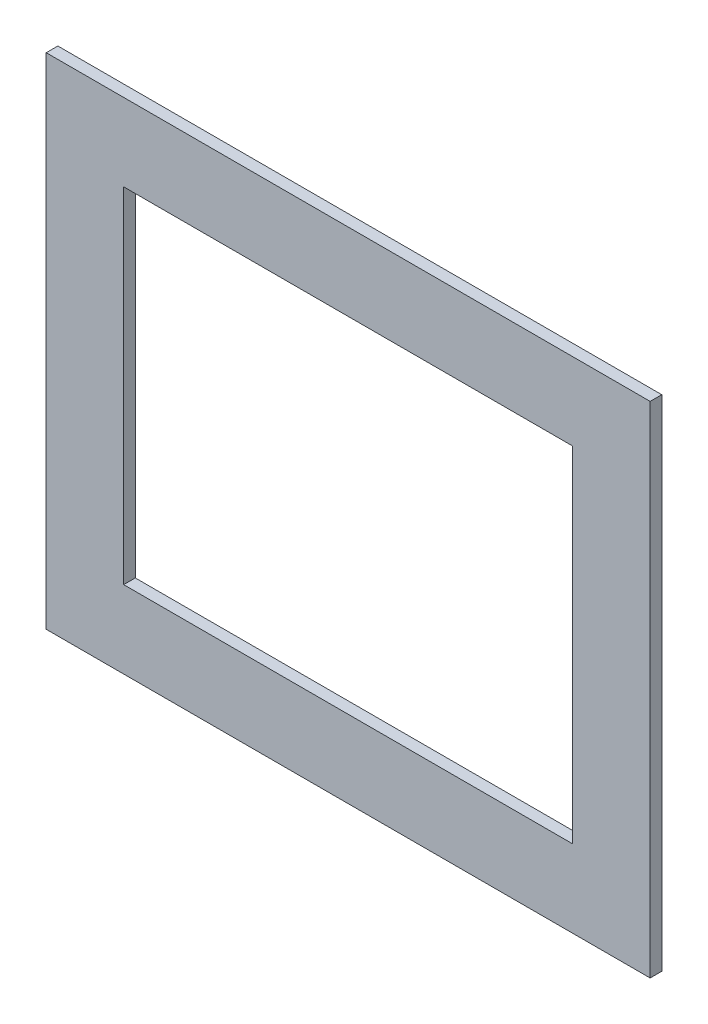
ISO-10303-21;
HEADER;
FILE_DESCRIPTION(('STEP AP214'),'2;1');
FILE_NAME('part.step','',(''),(''),'','','');
FILE_SCHEMA(('AUTOMOTIVE_DESIGN { 1 0 10303 214 1 1 1 1 }'));
ENDSEC;
DATA;
#1=APPLICATION_CONTEXT('core data for automotive mechanical design processes');
#2=APPLICATION_PROTOCOL_DEFINITION('international standard','automotive_design',2000,#1);
#3=PRODUCT_CONTEXT('',#1,'mechanical');
#4=PRODUCT('Part','Part','',(#3));
#5=PRODUCT_RELATED_PRODUCT_CATEGORY('part','',(#4));
#6=PRODUCT_DEFINITION_FORMATION('','',#4);
#7=PRODUCT_DEFINITION_CONTEXT('part definition',#1,'design');
#8=PRODUCT_DEFINITION('design','',#6,#7);
#9=PRODUCT_DEFINITION_SHAPE('','',#8);
#10=(LENGTH_UNIT() NAMED_UNIT(*) SI_UNIT(.MILLI.,.METRE.));
#11=(NAMED_UNIT(*) PLANE_ANGLE_UNIT() SI_UNIT($,.RADIAN.));
#12=(NAMED_UNIT(*) SI_UNIT($,.STERADIAN.) SOLID_ANGLE_UNIT());
#13=UNCERTAINTY_MEASURE_WITH_UNIT(LENGTH_MEASURE(1.E-05),#10,'distance_accuracy_value','');
#14=(GEOMETRIC_REPRESENTATION_CONTEXT(3) GLOBAL_UNCERTAINTY_ASSIGNED_CONTEXT((#13)) GLOBAL_UNIT_ASSIGNED_CONTEXT((#10,
#11,#12)) REPRESENTATION_CONTEXT('',''));
#15=CARTESIAN_POINT('',(0.,0.,0.));
#16=DIRECTION('',(0.,0.,1.));
#17=DIRECTION('',(1.,0.,0.));
#18=AXIS2_PLACEMENT_3D('',#15,#16,#17);
#19=CARTESIAN_POINT('',(0.,0.,5.));
#20=DIRECTION('',(0.,0.,-1.));
#21=DIRECTION('',(-1.,0.,0.));
#22=AXIS2_PLACEMENT_3D('',#19,#20,#21);
#23=PLANE('',#22);
#24=DIRECTION('',(0.,-1.,0.));
#25=VECTOR('',#24,1.);
#26=CARTESIAN_POINT('',(-153.,-2.,5.));
#27=LINE('',#26,#25);
#28=CARTESIAN_POINT('',(-153.,127.,5.));
#29=VERTEX_POINT('',#28);
#30=CARTESIAN_POINT('',(-153.,-2.,5.));
#31=VERTEX_POINT('',#30);
#32=EDGE_CURVE('E134',#29,#31,#27,.T.);
#33=ORIENTED_EDGE('',*,*,#32,.T.);
#34=DIRECTION('',(1.,0.,0.));
#35=VECTOR('',#34,1.);
#36=CARTESIAN_POINT('',(-153.,-2.,5.));
#37=LINE('',#36,#35);
#38=CARTESIAN_POINT('',(2.99999999999998,-2.,5.));
#39=VERTEX_POINT('',#38);
#40=EDGE_CURVE('E137',#31,#39,#37,.T.);
#41=ORIENTED_EDGE('',*,*,#40,.T.);
#42=DIRECTION('',(0.,1.,0.));
#43=VECTOR('',#42,1.);
#44=CARTESIAN_POINT('',(2.99999999999998,-2.,5.));
#45=LINE('',#44,#43);
#46=CARTESIAN_POINT('',(2.99999999999998,127.,5.));
#47=VERTEX_POINT('',#46);
#48=EDGE_CURVE('E140',#39,#47,#45,.T.);
#49=ORIENTED_EDGE('',*,*,#48,.T.);
#50=DIRECTION('',(-1.,0.,0.));
#51=VECTOR('',#50,1.);
#52=CARTESIAN_POINT('',(-153.,127.,5.));
#53=LINE('',#52,#51);
#54=EDGE_CURVE('E142',#47,#29,#53,.T.);
#55=ORIENTED_EDGE('',*,*,#54,.T.);
#56=EDGE_LOOP('',(#33,#41,#49,#55));
#57=FACE_BOUND('',#56,.T.);
#58=DIRECTION('',(0.,-1.,0.));
#59=VECTOR('',#58,1.);
#60=CARTESIAN_POINT('',(-133.,18.,5.));
#61=LINE('',#60,#59);
#62=CARTESIAN_POINT('',(-133.,107.,5.));
#63=VERTEX_POINT('',#62);
#64=CARTESIAN_POINT('',(-133.,18.,5.));
#65=VERTEX_POINT('',#64);
#66=EDGE_CURVE('E98',#63,#65,#61,.T.);
#67=ORIENTED_EDGE('',*,*,#66,.F.);
#68=DIRECTION('',(-1.,0.,0.));
#69=VECTOR('',#68,1.);
#70=CARTESIAN_POINT('',(-133.,107.,5.));
#71=LINE('',#70,#69);
#72=CARTESIAN_POINT('',(-17.,107.,5.));
#73=VERTEX_POINT('',#72);
#74=EDGE_CURVE('E120',#73,#63,#71,.T.);
#75=ORIENTED_EDGE('',*,*,#74,.F.);
#76=DIRECTION('',(0.,1.,0.));
#77=VECTOR('',#76,1.);
#78=CARTESIAN_POINT('',(-17.,18.,5.));
#79=LINE('',#78,#77);
#80=CARTESIAN_POINT('',(-17.,18.,5.));
#81=VERTEX_POINT('',#80);
#82=EDGE_CURVE('E118',#81,#73,#79,.T.);
#83=ORIENTED_EDGE('',*,*,#82,.F.);
#84=DIRECTION('',(1.,0.,0.));
#85=VECTOR('',#84,1.);
#86=CARTESIAN_POINT('',(-133.,18.,5.));
#87=LINE('',#86,#85);
#88=EDGE_CURVE('E106',#65,#81,#87,.T.);
#89=ORIENTED_EDGE('',*,*,#88,.F.);
#90=EDGE_LOOP('',(#67,#75,#83,#89));
#91=FACE_BOUND('',#90,.T.);
#92=ADVANCED_FACE('F33',(#57,#91),#23,.F.);
#93=CARTESIAN_POINT('',(0.,0.,2.));
#94=DIRECTION('',(0.,0.,-1.));
#95=DIRECTION('',(-1.,0.,0.));
#96=AXIS2_PLACEMENT_3D('',#93,#94,#95);
#97=PLANE('',#96);
#98=DIRECTION('',(0.,-1.,0.));
#99=VECTOR('',#98,1.);
#100=CARTESIAN_POINT('',(-153.,-2.,2.));
#101=LINE('',#100,#99);
#102=CARTESIAN_POINT('',(-153.,127.,2.));
#103=VERTEX_POINT('',#102);
#104=CARTESIAN_POINT('',(-153.,-2.,2.));
#105=VERTEX_POINT('',#104);
#106=EDGE_CURVE('E114',#103,#105,#101,.T.);
#107=ORIENTED_EDGE('',*,*,#106,.F.);
#108=DIRECTION('',(-1.,0.,0.));
#109=VECTOR('',#108,1.);
#110=CARTESIAN_POINT('',(-153.,127.,2.));
#111=LINE('',#110,#109);
#112=CARTESIAN_POINT('',(2.99999999999998,127.,2.));
#113=VERTEX_POINT('',#112);
#114=EDGE_CURVE('E138',#113,#103,#111,.T.);
#115=ORIENTED_EDGE('',*,*,#114,.F.);
#116=DIRECTION('',(0.,1.,0.));
#117=VECTOR('',#116,1.);
#118=CARTESIAN_POINT('',(2.99999999999998,-2.,2.));
#119=LINE('',#118,#117);
#120=CARTESIAN_POINT('',(2.99999999999998,-2.,2.));
#121=VERTEX_POINT('',#120);
#122=EDGE_CURVE('E149',#121,#113,#119,.T.);
#123=ORIENTED_EDGE('',*,*,#122,.F.);
#124=DIRECTION('',(1.,0.,0.));
#125=VECTOR('',#124,1.);
#126=CARTESIAN_POINT('',(-153.,-2.,2.));
#127=LINE('',#126,#125);
#128=EDGE_CURVE('E147',#105,#121,#127,.T.);
#129=ORIENTED_EDGE('',*,*,#128,.F.);
#130=EDGE_LOOP('',(#107,#115,#123,#129));
#131=FACE_BOUND('',#130,.T.);
#132=DIRECTION('',(-1.,0.,0.));
#133=VECTOR('',#132,1.);
#134=CARTESIAN_POINT('',(-133.,107.,2.));
#135=LINE('',#134,#133);
#136=CARTESIAN_POINT('',(-17.,107.,2.));
#137=VERTEX_POINT('',#136);
#138=CARTESIAN_POINT('',(-133.,107.,2.));
#139=VERTEX_POINT('',#138);
#140=EDGE_CURVE('E107',#137,#139,#135,.T.);
#141=ORIENTED_EDGE('',*,*,#140,.T.);
#142=DIRECTION('',(0.,-1.,0.));
#143=VECTOR('',#142,1.);
#144=CARTESIAN_POINT('',(-133.,18.,2.));
#145=LINE('',#144,#143);
#146=CARTESIAN_POINT('',(-133.,18.,2.));
#147=VERTEX_POINT('',#146);
#148=EDGE_CURVE('E56',#139,#147,#145,.T.);
#149=ORIENTED_EDGE('',*,*,#148,.T.);
#150=DIRECTION('',(1.,0.,0.));
#151=VECTOR('',#150,1.);
#152=CARTESIAN_POINT('',(-133.,18.,2.));
#153=LINE('',#152,#151);
#154=CARTESIAN_POINT('',(-17.,18.,2.));
#155=VERTEX_POINT('',#154);
#156=EDGE_CURVE('E113',#147,#155,#153,.T.);
#157=ORIENTED_EDGE('',*,*,#156,.T.);
#158=DIRECTION('',(0.,1.,0.));
#159=VECTOR('',#158,1.);
#160=CARTESIAN_POINT('',(-17.,18.,2.));
#161=LINE('',#160,#159);
#162=EDGE_CURVE('E126',#155,#137,#161,.T.);
#163=ORIENTED_EDGE('',*,*,#162,.T.);
#164=EDGE_LOOP('',(#141,#149,#157,#163));
#165=FACE_BOUND('',#164,.T.);
#166=ADVANCED_FACE('F167',(#131,#165),#97,.T.);
#167=CARTESIAN_POINT('',(-153.,-2.,5.));
#168=DIRECTION('',(1.,0.,0.));
#169=DIRECTION('',(0.,0.,-1.));
#170=AXIS2_PLACEMENT_3D('',#167,#168,#169);
#171=PLANE('',#170);
#172=ORIENTED_EDGE('',*,*,#106,.T.);
#173=DIRECTION('',(0.,0.,-1.));
#174=VECTOR('',#173,1.);
#175=CARTESIAN_POINT('',(-153.,-2.,5.));
#176=LINE('',#175,#174);
#177=EDGE_CURVE('E11',#31,#105,#176,.T.);
#178=ORIENTED_EDGE('',*,*,#177,.F.);
#179=ORIENTED_EDGE('',*,*,#32,.F.);
#180=DIRECTION('',(0.,0.,-1.));
#181=VECTOR('',#180,1.);
#182=CARTESIAN_POINT('',(-153.,127.,5.));
#183=LINE('',#182,#181);
#184=EDGE_CURVE('E144',#29,#103,#183,.T.);
#185=ORIENTED_EDGE('',*,*,#184,.T.);
#186=EDGE_LOOP('',(#172,#178,#179,#185));
#187=FACE_BOUND('',#186,.T.);
#188=ADVANCED_FACE('F35',(#187),#171,.F.);
#189=CARTESIAN_POINT('',(-153.,-2.,5.));
#190=DIRECTION('',(0.,1.,0.));
#191=DIRECTION('',(0.,0.,1.));
#192=AXIS2_PLACEMENT_3D('',#189,#190,#191);
#193=PLANE('',#192);
#194=ORIENTED_EDGE('',*,*,#128,.T.);
#195=DIRECTION('',(0.,0.,-1.));
#196=VECTOR('',#195,1.);
#197=CARTESIAN_POINT('',(2.99999999999998,-2.,5.));
#198=LINE('',#197,#196);
#199=EDGE_CURVE('E41',#39,#121,#198,.T.);
#200=ORIENTED_EDGE('',*,*,#199,.F.);
#201=ORIENTED_EDGE('',*,*,#40,.F.);
#202=ORIENTED_EDGE('',*,*,#177,.T.);
#203=EDGE_LOOP('',(#194,#200,#201,#202));
#204=FACE_BOUND('',#203,.T.);
#205=ADVANCED_FACE('F177',(#204),#193,.F.);
#206=CARTESIAN_POINT('',(2.99999999999998,-2.,5.));
#207=DIRECTION('',(-1.,0.,0.));
#208=DIRECTION('',(0.,0.,1.));
#209=AXIS2_PLACEMENT_3D('',#206,#207,#208);
#210=PLANE('',#209);
#211=ORIENTED_EDGE('',*,*,#122,.T.);
#212=DIRECTION('',(0.,0.,-1.));
#213=VECTOR('',#212,1.);
#214=CARTESIAN_POINT('',(2.99999999999998,127.,5.));
#215=LINE('',#214,#213);
#216=EDGE_CURVE('E154',#47,#113,#215,.T.);
#217=ORIENTED_EDGE('',*,*,#216,.F.);
#218=ORIENTED_EDGE('',*,*,#48,.F.);
#219=ORIENTED_EDGE('',*,*,#199,.T.);
#220=EDGE_LOOP('',(#211,#217,#218,#219));
#221=FACE_BOUND('',#220,.T.);
#222=ADVANCED_FACE('F161',(#221),#210,.F.);
#223=CARTESIAN_POINT('',(-153.,127.,5.));
#224=DIRECTION('',(0.,-1.,0.));
#225=DIRECTION('',(0.,0.,-1.));
#226=AXIS2_PLACEMENT_3D('',#223,#224,#225);
#227=PLANE('',#226);
#228=ORIENTED_EDGE('',*,*,#114,.T.);
#229=ORIENTED_EDGE('',*,*,#184,.F.);
#230=ORIENTED_EDGE('',*,*,#54,.F.);
#231=ORIENTED_EDGE('',*,*,#216,.T.);
#232=EDGE_LOOP('',(#228,#229,#230,#231));
#233=FACE_BOUND('',#232,.T.);
#234=ADVANCED_FACE('F171',(#233),#227,.F.);
#235=CARTESIAN_POINT('',(-133.,18.,5.));
#236=DIRECTION('',(1.,0.,0.));
#237=DIRECTION('',(0.,0.,-1.));
#238=AXIS2_PLACEMENT_3D('',#235,#236,#237);
#239=PLANE('',#238);
#240=ORIENTED_EDGE('',*,*,#148,.F.);
#241=DIRECTION('',(0.,0.,-1.));
#242=VECTOR('',#241,1.);
#243=CARTESIAN_POINT('',(-133.,107.,5.));
#244=LINE('',#243,#242);
#245=EDGE_CURVE('E102',#63,#139,#244,.T.);
#246=ORIENTED_EDGE('',*,*,#245,.F.);
#247=ORIENTED_EDGE('',*,*,#66,.T.);
#248=DIRECTION('',(0.,0.,-1.));
#249=VECTOR('',#248,1.);
#250=CARTESIAN_POINT('',(-133.,18.,5.));
#251=LINE('',#250,#249);
#252=EDGE_CURVE('E101',#65,#147,#251,.T.);
#253=ORIENTED_EDGE('',*,*,#252,.T.);
#254=EDGE_LOOP('',(#240,#246,#247,#253));
#255=FACE_BOUND('',#254,.T.);
#256=ADVANCED_FACE('F100',(#255),#239,.T.);
#257=CARTESIAN_POINT('',(-133.,18.,5.));
#258=DIRECTION('',(0.,1.,0.));
#259=DIRECTION('',(0.,0.,1.));
#260=AXIS2_PLACEMENT_3D('',#257,#258,#259);
#261=PLANE('',#260);
#262=ORIENTED_EDGE('',*,*,#156,.F.);
#263=ORIENTED_EDGE('',*,*,#252,.F.);
#264=ORIENTED_EDGE('',*,*,#88,.T.);
#265=DIRECTION('',(0.,0.,-1.));
#266=VECTOR('',#265,1.);
#267=CARTESIAN_POINT('',(-17.,18.,5.));
#268=LINE('',#267,#266);
#269=EDGE_CURVE('E115',#81,#155,#268,.T.);
#270=ORIENTED_EDGE('',*,*,#269,.T.);
#271=EDGE_LOOP('',(#262,#263,#264,#270));
#272=FACE_BOUND('',#271,.T.);
#273=ADVANCED_FACE('F110',(#272),#261,.T.);
#274=CARTESIAN_POINT('',(-17.,18.,5.));
#275=DIRECTION('',(-1.,0.,0.));
#276=DIRECTION('',(0.,0.,1.));
#277=AXIS2_PLACEMENT_3D('',#274,#275,#276);
#278=PLANE('',#277);
#279=ORIENTED_EDGE('',*,*,#162,.F.);
#280=ORIENTED_EDGE('',*,*,#269,.F.);
#281=ORIENTED_EDGE('',*,*,#82,.T.);
#282=DIRECTION('',(0.,0.,-1.));
#283=VECTOR('',#282,1.);
#284=CARTESIAN_POINT('',(-17.,107.,5.));
#285=LINE('',#284,#283);
#286=EDGE_CURVE('E48',#73,#137,#285,.T.);
#287=ORIENTED_EDGE('',*,*,#286,.T.);
#288=EDGE_LOOP('',(#279,#280,#281,#287));
#289=FACE_BOUND('',#288,.T.);
#290=ADVANCED_FACE('F200',(#289),#278,.T.);
#291=CARTESIAN_POINT('',(-133.,107.,5.));
#292=DIRECTION('',(0.,-1.,0.));
#293=DIRECTION('',(0.,0.,-1.));
#294=AXIS2_PLACEMENT_3D('',#291,#292,#293);
#295=PLANE('',#294);
#296=ORIENTED_EDGE('',*,*,#140,.F.);
#297=ORIENTED_EDGE('',*,*,#286,.F.);
#298=ORIENTED_EDGE('',*,*,#74,.T.);
#299=ORIENTED_EDGE('',*,*,#245,.T.);
#300=EDGE_LOOP('',(#296,#297,#298,#299));
#301=FACE_BOUND('',#300,.T.);
#302=ADVANCED_FACE('F204',(#301),#295,.T.);
#303=CLOSED_SHELL('',(#92,#166,#188,#205,#222,#234,#256,#273,#290,#302));
#304=MANIFOLD_SOLID_BREP('B2',#303);
#305=ADVANCED_BREP_SHAPE_REPRESENTATION('',(#18,#304),#14);
#306=SHAPE_DEFINITION_REPRESENTATION(#9,#305);
ENDSEC;
END-ISO-10303-21;
